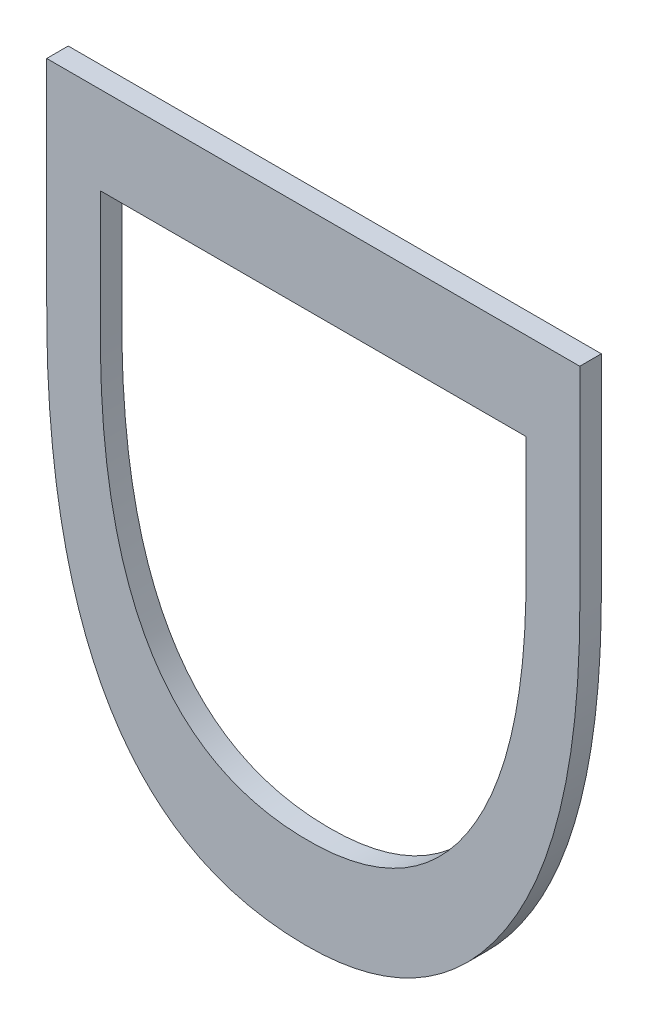
ISO-10303-21;
HEADER;
FILE_DESCRIPTION(('STEP AP214'),'2;1');
FILE_NAME('part.step','',(''),(''),'','','');
FILE_SCHEMA(('AUTOMOTIVE_DESIGN { 1 0 10303 214 1 1 1 1 }'));
ENDSEC;
DATA;
#1=APPLICATION_CONTEXT('core data for automotive mechanical design processes');
#2=APPLICATION_PROTOCOL_DEFINITION('international standard','automotive_design',2000,#1);
#3=PRODUCT_CONTEXT('',#1,'mechanical');
#4=PRODUCT('Part','Part','',(#3));
#5=PRODUCT_RELATED_PRODUCT_CATEGORY('part','',(#4));
#6=PRODUCT_DEFINITION_FORMATION('','',#4);
#7=PRODUCT_DEFINITION_CONTEXT('part definition',#1,'design');
#8=PRODUCT_DEFINITION('design','',#6,#7);
#9=PRODUCT_DEFINITION_SHAPE('','',#8);
#10=(LENGTH_UNIT() NAMED_UNIT(*) SI_UNIT(.MILLI.,.METRE.));
#11=(NAMED_UNIT(*) PLANE_ANGLE_UNIT() SI_UNIT($,.RADIAN.));
#12=(NAMED_UNIT(*) SI_UNIT($,.STERADIAN.) SOLID_ANGLE_UNIT());
#13=UNCERTAINTY_MEASURE_WITH_UNIT(LENGTH_MEASURE(1.E-05),#10,'distance_accuracy_value','');
#14=(GEOMETRIC_REPRESENTATION_CONTEXT(3) GLOBAL_UNCERTAINTY_ASSIGNED_CONTEXT((#13)) GLOBAL_UNIT_ASSIGNED_CONTEXT((#10,
#11,#12)) REPRESENTATION_CONTEXT('',''));
#15=CARTESIAN_POINT('',(0.,0.,0.));
#16=DIRECTION('',(0.,0.,1.));
#17=DIRECTION('',(1.,0.,0.));
#18=AXIS2_PLACEMENT_3D('',#15,#16,#17);
#19=CARTESIAN_POINT('',(-8.95983005625009,-22.770458436575,135.210489149433));
#20=DIRECTION('',(0.,0.,-1.));
#21=DIRECTION('',(0.,-1.,0.));
#22=AXIS2_PLACEMENT_3D('',#19,#20,#21);
#23=PLANE('',#22);
#24=CARTESIAN_POINT('',(-13.8325482804087,-1.20886612369463,135.210489149433));
#25=CARTESIAN_POINT('',(-13.8325482804087,-2.21453774498063,135.210489149433));
#26=CARTESIAN_POINT('',(-13.8325482804087,-3.22020936626664,135.210489149433));
#27=CARTESIAN_POINT('',(-13.8325482804087,-8.13842197629124,135.210489149433));
#28=CARTESIAN_POINT('',(-12.6273384456497,-10.094692821411,135.210489149433));
#29=CARTESIAN_POINT('',(-9.061195241034,-10.094692821411,135.210489149433));
#30=CARTESIAN_POINT('',(-8.1385310894113,-9.56791206122824,135.210489149433));
#31=CARTESIAN_POINT('',(-6.7593248729568,-7.46079070448884,135.210489149433));
#32=CARTESIAN_POINT('',(-6.41452319026449,-5.99298890984983,135.210489149433));
#33=CARTESIAN_POINT('',(-6.41452319026449,-3.14358667657934,135.210489149433));
#34=CARTESIAN_POINT('',(-6.41452319026449,-2.17622640013694,135.210489149433));
#35=CARTESIAN_POINT('',(-6.41452319026449,-1.20886612369463,135.210489149433));
#36=(BOUNDED_CURVE() B_SPLINE_CURVE(3,(#24,#25,#26,#27,#28,#29,#30,#31,#32,#33,#34,#35),
.UNSPECIFIED.,.F.,.F.) B_SPLINE_CURVE_WITH_KNOTS((4,2,2,2,2,4),(0.,0.104384105417481,
0.510487929344108,0.705202651644714,0.899917519166078,1.),
.UNSPECIFIED.) CURVE() GEOMETRIC_REPRESENTATION_ITEM() RATIONAL_B_SPLINE_CURVE((1.,1.,1.,1.,1.,
1.,1.,1.,1.,1.,1.,1.)) REPRESENTATION_ITEM(''));
#37=CARTESIAN_POINT('',(-13.8325482804087,-1.20886612369463,135.210489149433));
#38=VERTEX_POINT('',#37);
#39=CARTESIAN_POINT('',(-6.41452319026449,-1.20886612369463,135.210489149433));
#40=VERTEX_POINT('',#39);
#41=EDGE_CURVE('E11',#38,#40,#36,.T.);
#42=ORIENTED_EDGE('',*,*,#41,.T.);
#43=DIRECTION('',(-1.,0.,0.));
#44=VECTOR('',#43,1.);
#45=CARTESIAN_POINT('',(2.66453525910038E-13,-1.20886612369463,135.210489149433));
#46=LINE('',#45,#44);
#47=EDGE_CURVE('E152',#40,#38,#46,.T.);
#48=ORIENTED_EDGE('',*,*,#47,.T.);
#49=EDGE_LOOP('',(#42,#48));
#50=FACE_BOUND('',#49,.T.);
#51=CARTESIAN_POINT('',(-7.16159350276449,-2.43003874989653,135.210489149433));
#52=CARTESIAN_POINT('',(-7.16159350276449,-2.99513039653124,135.210489149433));
#53=CARTESIAN_POINT('',(-7.16159350276449,-3.56022204316583,135.210489149433));
#54=CARTESIAN_POINT('',(-7.16159350276449,-5.60508757802154,135.210489149433));
#55=CARTESIAN_POINT('',(-7.42657987323588,-6.75682051126433,135.210489149433));
#56=CARTESIAN_POINT('',(-8.48652576988016,-8.40420660669994,135.210489149433));
#57=CARTESIAN_POINT('',(-9.23199965358236,-8.81605324809374,135.210489149433));
#58=CARTESIAN_POINT('',(-12.1213101749282,-8.81605324809374,135.210489149433));
#59=CARTESIAN_POINT('',(-13.0854779679087,-7.27641776956044,135.210489149433));
#60=CARTESIAN_POINT('',(-13.0854779679087,-3.60811125929543,135.210489149433));
#61=CARTESIAN_POINT('',(-13.0854779679087,-3.01907500459604,135.210489149433));
#62=CARTESIAN_POINT('',(-13.0854779679087,-2.43003874989653,135.210489149433));
#63=(BOUNDED_CURVE() B_SPLINE_CURVE(3,(#51,#52,#53,#54,#55,#56,#57,#58,#59,#60,#61,#62),
.UNSPECIFIED.,.F.,.F.) B_SPLINE_CURVE_WITH_KNOTS((4,2,2,2,2,4),(0.,0.0800183044780574,
0.289557762814667,0.499097055222359,0.919567791368009,1.),
.UNSPECIFIED.) CURVE() GEOMETRIC_REPRESENTATION_ITEM() RATIONAL_B_SPLINE_CURVE((1.,1.,1.,1.,1.,
1.,1.,1.,1.,1.,1.,1.)) REPRESENTATION_ITEM(''));
#64=CARTESIAN_POINT('',(-7.16159350276449,-2.43003874989653,135.210489149433));
#65=VERTEX_POINT('',#64);
#66=CARTESIAN_POINT('',(-13.0854779679087,-2.43003874989653,135.210489149433));
#67=VERTEX_POINT('',#66);
#68=EDGE_CURVE('E89',#65,#67,#63,.T.);
#69=ORIENTED_EDGE('',*,*,#68,.T.);
#70=DIRECTION('',(1.,0.,0.));
#71=VECTOR('',#70,1.);
#72=CARTESIAN_POINT('',(2.66453525910038E-13,-2.43003874989653,135.210489149433));
#73=LINE('',#72,#71);
#74=EDGE_CURVE('E120',#67,#65,#73,.T.);
#75=ORIENTED_EDGE('',*,*,#74,.T.);
#76=EDGE_LOOP('',(#69,#75));
#77=FACE_BOUND('',#76,.T.);
#78=ADVANCED_FACE('F42',(#50,#77),#23,.F.);
#79=CARTESIAN_POINT('',(-13.8325482804087,-1.20886612369463,135.410489149433));
#80=CARTESIAN_POINT('',(-13.8325482804087,-2.21453774498063,135.410489149433));
#81=CARTESIAN_POINT('',(-13.8325482804087,-3.22020936626664,135.410489149433));
#82=CARTESIAN_POINT('',(-13.8325482804087,-8.13842197629124,135.410489149433));
#83=CARTESIAN_POINT('',(-12.6273384456497,-10.094692821411,135.410489149433));
#84=CARTESIAN_POINT('',(-9.061195241034,-10.094692821411,135.410489149433));
#85=CARTESIAN_POINT('',(-8.1385310894113,-9.56791206122824,135.410489149433));
#86=CARTESIAN_POINT('',(-6.7593248729568,-7.46079070448884,135.410489149433));
#87=CARTESIAN_POINT('',(-6.41452319026449,-5.99298890984983,135.410489149433));
#88=CARTESIAN_POINT('',(-6.41452319026449,-3.14358667657934,135.410489149433));
#89=CARTESIAN_POINT('',(-6.41452319026449,-2.17622640013694,135.410489149433));
#90=CARTESIAN_POINT('',(-6.41452319026449,-1.20886612369463,135.410489149433));
#91=(BOUNDED_CURVE() B_SPLINE_CURVE(3,(#79,#80,#81,#82,#83,#84,#85,#86,#87,#88,#89,#90),
.UNSPECIFIED.,.F.,.F.) B_SPLINE_CURVE_WITH_KNOTS((4,2,2,2,2,4),(0.,0.104384105417481,
0.510487929344108,0.705202651644714,0.899917519166078,1.),
.UNSPECIFIED.) CURVE() GEOMETRIC_REPRESENTATION_ITEM() RATIONAL_B_SPLINE_CURVE((1.,1.,1.,1.,1.,
1.,1.,1.,1.,1.,1.,1.)) REPRESENTATION_ITEM(''));
#92=DIRECTION('',(0.,0.,-1.));
#93=VECTOR('',#92,1.);
#94=SURFACE_OF_LINEAR_EXTRUSION('',#91,#93);
#95=ORIENTED_EDGE('',*,*,#41,.F.);
#96=CARTESIAN_POINT('',(-13.8325482804087,-1.20886612369463,135.210489149433));
#97=CARTESIAN_POINT('',(-13.8325482804087,-1.20886612369463,134.910489149433));
#98=(BOUNDED_CURVE() B_SPLINE_CURVE(1,(#96,#97),.UNSPECIFIED.,.F.,
.F.) B_SPLINE_CURVE_WITH_KNOTS((2,2),(0.,1.),
.UNSPECIFIED.) CURVE() GEOMETRIC_REPRESENTATION_ITEM() RATIONAL_B_SPLINE_CURVE((1.,1.)) REPRESENTATION_ITEM(''));
#99=CARTESIAN_POINT('',(-13.8325482804087,-1.20886612369463,134.910489149433));
#100=VERTEX_POINT('',#99);
#101=EDGE_CURVE('E47',#38,#100,#98,.T.);
#102=ORIENTED_EDGE('',*,*,#101,.T.);
#103=CARTESIAN_POINT('',(-6.41452319026449,-1.20886612369463,134.910489149433));
#104=CARTESIAN_POINT('',(-6.41452319026449,-2.17622640013694,134.910489149433));
#105=CARTESIAN_POINT('',(-6.41452319026449,-3.14358667657934,134.910489149433));
#106=CARTESIAN_POINT('',(-6.41452319026449,-5.99298890984983,134.910489149433));
#107=CARTESIAN_POINT('',(-6.7593248729568,-7.46079070448884,134.910489149433));
#108=CARTESIAN_POINT('',(-8.1385310894113,-9.56791206122824,134.910489149433));
#109=CARTESIAN_POINT('',(-9.061195241034,-10.094692821411,134.910489149433));
#110=CARTESIAN_POINT('',(-12.6273384456497,-10.094692821411,134.910489149433));
#111=CARTESIAN_POINT('',(-13.8325482804087,-8.13842197629124,134.910489149433));
#112=CARTESIAN_POINT('',(-13.8325482804087,-3.22020936626664,134.910489149433));
#113=CARTESIAN_POINT('',(-13.8325482804087,-2.21453774498063,134.910489149433));
#114=CARTESIAN_POINT('',(-13.8325482804087,-1.20886612369463,134.910489149433));
#115=(BOUNDED_CURVE() B_SPLINE_CURVE(3,(#103,#104,#105,#106,#107,#108,#109,#110,#111,#112,#113,
#114),.UNSPECIFIED.,.F.,.F.) B_SPLINE_CURVE_WITH_KNOTS((4,2,2,2,2,4),(0.,0.100082480833922,
0.294797348355286,0.489512070655892,0.895615894582519,1.),
.UNSPECIFIED.) CURVE() GEOMETRIC_REPRESENTATION_ITEM() RATIONAL_B_SPLINE_CURVE((1.,1.,1.,1.,1.,
1.,1.,1.,1.,1.,1.,1.)) REPRESENTATION_ITEM(''));
#116=CARTESIAN_POINT('',(-6.41452319026449,-1.20886612369463,134.910489149433));
#117=VERTEX_POINT('',#116);
#118=EDGE_CURVE('E105',#117,#100,#115,.T.);
#119=ORIENTED_EDGE('',*,*,#118,.F.);
#120=CARTESIAN_POINT('',(-6.41452319026449,-1.20886612369463,134.910489149433));
#121=CARTESIAN_POINT('',(-6.41452319026449,-1.20886612369463,135.210489149433));
#122=(BOUNDED_CURVE() B_SPLINE_CURVE(1,(#120,#121),.UNSPECIFIED.,.F.,
.F.) B_SPLINE_CURVE_WITH_KNOTS((2,2),(0.,1.),
.UNSPECIFIED.) CURVE() GEOMETRIC_REPRESENTATION_ITEM() RATIONAL_B_SPLINE_CURVE((1.,1.)) REPRESENTATION_ITEM(''));
#123=EDGE_CURVE('E159',#117,#40,#122,.T.);
#124=ORIENTED_EDGE('',*,*,#123,.T.);
#125=EDGE_LOOP('',(#95,#102,#119,#124));
#126=FACE_BOUND('',#125,.T.);
#127=ADVANCED_FACE('F198',(#126),#94,.F.);
#128=CARTESIAN_POINT('',(-13.8325482804087,-1.20886612369463,135.410489149433));
#129=DIRECTION('',(0.,1.,0.));
#130=DIRECTION('',(1.,0.,0.));
#131=AXIS2_PLACEMENT_3D('',#128,#129,#130);
#132=PLANE('',#131);
#133=ORIENTED_EDGE('',*,*,#47,.F.);
#134=ORIENTED_EDGE('',*,*,#123,.F.);
#135=CARTESIAN_POINT('',(-13.8325482804087,-1.20886612369463,134.910489149433));
#136=CARTESIAN_POINT('',(-11.3598732503606,-1.20886612369463,134.910489149433));
#137=CARTESIAN_POINT('',(-8.88719822031257,-1.20886612369463,134.910489149433));
#138=CARTESIAN_POINT('',(-6.41452319026449,-1.20886612369463,134.910489149433));
#139=(BOUNDED_CURVE() B_SPLINE_CURVE(3,(#135,#136,#137,#138),.UNSPECIFIED.,.F.,
.F.) B_SPLINE_CURVE_WITH_KNOTS((4,4),(0.,1.),
.UNSPECIFIED.) CURVE() GEOMETRIC_REPRESENTATION_ITEM() RATIONAL_B_SPLINE_CURVE((1.,1.,1.,1.)) REPRESENTATION_ITEM(''));
#140=EDGE_CURVE('E131',#100,#117,#139,.T.);
#141=ORIENTED_EDGE('',*,*,#140,.F.);
#142=ORIENTED_EDGE('',*,*,#101,.F.);
#143=EDGE_LOOP('',(#133,#134,#141,#142));
#144=FACE_BOUND('',#143,.T.);
#145=ADVANCED_FACE('F201',(#144),#132,.T.);
#146=CARTESIAN_POINT('',(-10.401260528621,-10.0907785081063,134.910489149433));
#147=DIRECTION('',(0.,0.,1.));
#148=DIRECTION('',(1.,0.,0.));
#149=AXIS2_PLACEMENT_3D('',#146,#147,#148);
#150=PLANE('',#149);
#151=ORIENTED_EDGE('',*,*,#118,.T.);
#152=ORIENTED_EDGE('',*,*,#140,.T.);
#153=EDGE_LOOP('',(#151,#152));
#154=FACE_BOUND('',#153,.T.);
#155=CARTESIAN_POINT('',(-7.16159350276449,-2.43003874989653,134.910489149433));
#156=CARTESIAN_POINT('',(-9.13622165781257,-2.43003874989653,134.910489149433));
#157=CARTESIAN_POINT('',(-11.1108498128606,-2.43003874989653,134.910489149433));
#158=CARTESIAN_POINT('',(-13.0854779679087,-2.43003874989653,134.910489149433));
#159=(BOUNDED_CURVE() B_SPLINE_CURVE(3,(#155,#156,#157,#158),.UNSPECIFIED.,.F.,
.F.) B_SPLINE_CURVE_WITH_KNOTS((4,4),(0.,1.),
.UNSPECIFIED.) CURVE() GEOMETRIC_REPRESENTATION_ITEM() RATIONAL_B_SPLINE_CURVE((1.,1.,1.,1.)) REPRESENTATION_ITEM(''));
#160=CARTESIAN_POINT('',(-7.16159350276449,-2.43003874989653,134.910489149433));
#161=VERTEX_POINT('',#160);
#162=CARTESIAN_POINT('',(-13.0854779679087,-2.43003874989653,134.910489149433));
#163=VERTEX_POINT('',#162);
#164=EDGE_CURVE('E102',#161,#163,#159,.T.);
#165=ORIENTED_EDGE('',*,*,#164,.T.);
#166=CARTESIAN_POINT('',(-13.0854779679087,-2.43003874989653,134.910489149433));
#167=CARTESIAN_POINT('',(-13.0854779679087,-3.01907500459604,134.910489149433));
#168=CARTESIAN_POINT('',(-13.0854779679087,-3.60811125929543,134.910489149433));
#169=CARTESIAN_POINT('',(-13.0854779679087,-7.27641776956044,134.910489149433));
#170=CARTESIAN_POINT('',(-12.1213101749282,-8.81605324809374,134.910489149433));
#171=CARTESIAN_POINT('',(-9.23199965358236,-8.81605324809374,134.910489149433));
#172=CARTESIAN_POINT('',(-8.48652576988016,-8.40420660669994,134.910489149433));
#173=CARTESIAN_POINT('',(-7.42657987323588,-6.75682051126433,134.910489149433));
#174=CARTESIAN_POINT('',(-7.16159350276449,-5.60508757802154,134.910489149433));
#175=CARTESIAN_POINT('',(-7.16159350276449,-3.56022204316583,134.910489149433));
#176=CARTESIAN_POINT('',(-7.16159350276449,-2.99513039653124,134.910489149433));
#177=CARTESIAN_POINT('',(-7.16159350276449,-2.43003874989653,134.910489149433));
#178=(BOUNDED_CURVE() B_SPLINE_CURVE(3,(#166,#167,#168,#169,#170,#171,#172,#173,#174,#175,#176,
#177),.UNSPECIFIED.,.F.,.F.) B_SPLINE_CURVE_WITH_KNOTS((4,2,2,2,2,4),(0.,0.0804322086319911,
0.500902944777641,0.710442237185333,0.919981695521943,1.),
.UNSPECIFIED.) CURVE() GEOMETRIC_REPRESENTATION_ITEM() RATIONAL_B_SPLINE_CURVE((1.,1.,1.,1.,1.,
1.,1.,1.,1.,1.,1.,1.)) REPRESENTATION_ITEM(''));
#179=EDGE_CURVE('E96',#163,#161,#178,.T.);
#180=ORIENTED_EDGE('',*,*,#179,.T.);
#181=EDGE_LOOP('',(#165,#180));
#182=FACE_BOUND('',#181,.T.);
#183=ADVANCED_FACE('F100',(#154,#182),#150,.F.);
#184=CARTESIAN_POINT('',(-7.16159350276449,-2.43003874989653,135.410489149433));
#185=CARTESIAN_POINT('',(-7.16159350276449,-2.99513039653124,135.410489149433));
#186=CARTESIAN_POINT('',(-7.16159350276449,-3.56022204316583,135.410489149433));
#187=CARTESIAN_POINT('',(-7.16159350276449,-5.60508757802154,135.410489149433));
#188=CARTESIAN_POINT('',(-7.42657987323588,-6.75682051126433,135.410489149433));
#189=CARTESIAN_POINT('',(-8.48652576988016,-8.40420660669994,135.410489149433));
#190=CARTESIAN_POINT('',(-9.23199965358236,-8.81605324809374,135.410489149433));
#191=CARTESIAN_POINT('',(-12.1213101749282,-8.81605324809374,135.410489149433));
#192=CARTESIAN_POINT('',(-13.0854779679087,-7.27641776956044,135.410489149433));
#193=CARTESIAN_POINT('',(-13.0854779679087,-3.60811125929543,135.410489149433));
#194=CARTESIAN_POINT('',(-13.0854779679087,-3.01907500459604,135.410489149433));
#195=CARTESIAN_POINT('',(-13.0854779679087,-2.43003874989653,135.410489149433));
#196=(BOUNDED_CURVE() B_SPLINE_CURVE(3,(#184,#185,#186,#187,#188,#189,#190,#191,#192,#193,#194,
#195),.UNSPECIFIED.,.F.,.F.) B_SPLINE_CURVE_WITH_KNOTS((4,2,2,2,2,4),(0.,0.0800183044780574,
0.289557762814667,0.499097055222359,0.919567791368009,1.),
.UNSPECIFIED.) CURVE() GEOMETRIC_REPRESENTATION_ITEM() RATIONAL_B_SPLINE_CURVE((1.,1.,1.,1.,1.,
1.,1.,1.,1.,1.,1.,1.)) REPRESENTATION_ITEM(''));
#197=DIRECTION('',(0.,0.,-1.));
#198=VECTOR('',#197,1.);
#199=SURFACE_OF_LINEAR_EXTRUSION('',#196,#198);
#200=ORIENTED_EDGE('',*,*,#68,.F.);
#201=CARTESIAN_POINT('',(-7.16159350276449,-2.43003874989653,134.910489149433));
#202=CARTESIAN_POINT('',(-7.16159350276449,-2.43003874989653,135.010489149433));
#203=CARTESIAN_POINT('',(-7.16159350276449,-2.43003874989653,135.110489149433));
#204=CARTESIAN_POINT('',(-7.16159350276449,-2.43003874989653,135.210489149433));
#205=(BOUNDED_CURVE() B_SPLINE_CURVE(3,(#201,#202,#203,#204),.UNSPECIFIED.,.F.,
.F.) B_SPLINE_CURVE_WITH_KNOTS((4,4),(0.,1.),
.UNSPECIFIED.) CURVE() GEOMETRIC_REPRESENTATION_ITEM() RATIONAL_B_SPLINE_CURVE((1.,1.,1.,1.)) REPRESENTATION_ITEM(''));
#206=EDGE_CURVE('E107',#161,#65,#205,.T.);
#207=ORIENTED_EDGE('',*,*,#206,.F.);
#208=ORIENTED_EDGE('',*,*,#179,.F.);
#209=CARTESIAN_POINT('',(-13.0854779679087,-2.43003874989653,135.210489149433));
#210=CARTESIAN_POINT('',(-13.0854779679087,-2.43003874989653,135.110489149433));
#211=CARTESIAN_POINT('',(-13.0854779679087,-2.43003874989653,135.010489149433));
#212=CARTESIAN_POINT('',(-13.0854779679087,-2.43003874989653,134.910489149433));
#213=(BOUNDED_CURVE() B_SPLINE_CURVE(3,(#209,#210,#211,#212),.UNSPECIFIED.,.F.,
.F.) B_SPLINE_CURVE_WITH_KNOTS((4,4),(0.,1.),
.UNSPECIFIED.) CURVE() GEOMETRIC_REPRESENTATION_ITEM() RATIONAL_B_SPLINE_CURVE((1.,1.,1.,1.)) REPRESENTATION_ITEM(''));
#214=EDGE_CURVE('E114',#67,#163,#213,.T.);
#215=ORIENTED_EDGE('',*,*,#214,.F.);
#216=EDGE_LOOP('',(#200,#207,#208,#215));
#217=FACE_BOUND('',#216,.T.);
#218=ADVANCED_FACE('F44',(#217),#199,.F.);
#219=CARTESIAN_POINT('',(-7.16159350276449,-2.43003874989653,135.410489149433));
#220=DIRECTION('',(0.,-1.,0.));
#221=DIRECTION('',(0.,0.,-1.));
#222=AXIS2_PLACEMENT_3D('',#219,#220,#221);
#223=PLANE('',#222);
#224=ORIENTED_EDGE('',*,*,#74,.F.);
#225=ORIENTED_EDGE('',*,*,#214,.T.);
#226=ORIENTED_EDGE('',*,*,#164,.F.);
#227=ORIENTED_EDGE('',*,*,#206,.T.);
#228=EDGE_LOOP('',(#224,#225,#226,#227));
#229=FACE_BOUND('',#228,.T.);
#230=ADVANCED_FACE('F113',(#229),#223,.T.);
#231=CLOSED_SHELL('',(#78,#127,#145,#183,#218,#230));
#232=MANIFOLD_SOLID_BREP('B2',#231);
#233=ADVANCED_BREP_SHAPE_REPRESENTATION('',(#18,#232),#14);
#234=SHAPE_DEFINITION_REPRESENTATION(#9,#233);
ENDSEC;
END-ISO-10303-21;
